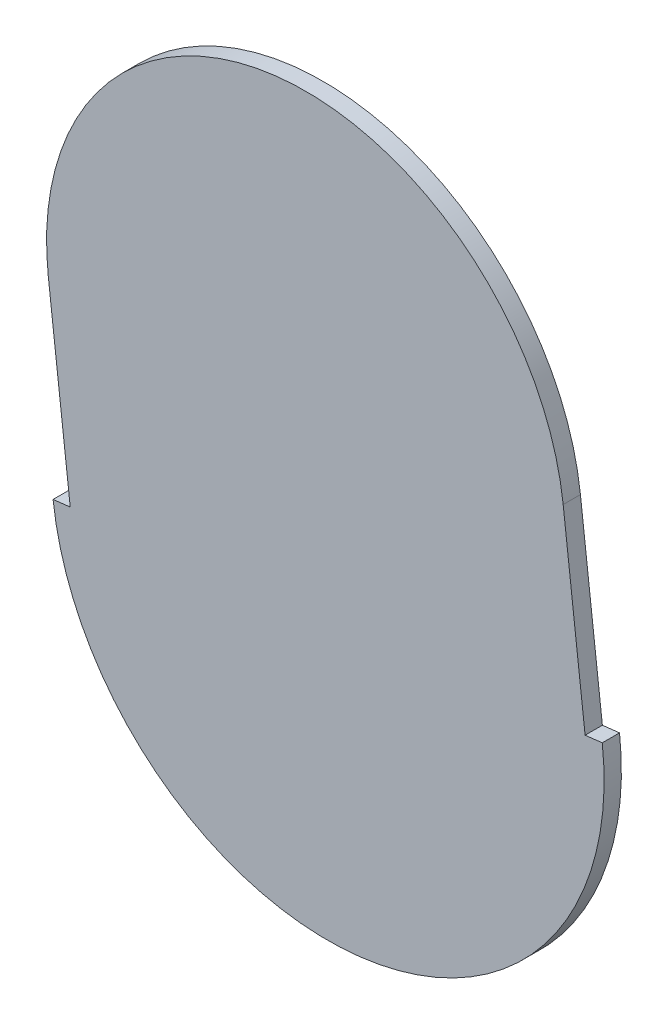
ISO-10303-21;
HEADER;
FILE_DESCRIPTION(('STEP AP214'),'2;1');
FILE_NAME('part.step','',(''),(''),'','','');
FILE_SCHEMA(('AUTOMOTIVE_DESIGN { 1 0 10303 214 1 1 1 1 }'));
ENDSEC;
DATA;
#1=APPLICATION_CONTEXT('core data for automotive mechanical design processes');
#2=APPLICATION_PROTOCOL_DEFINITION('international standard','automotive_design',2000,#1);
#3=PRODUCT_CONTEXT('',#1,'mechanical');
#4=PRODUCT('Part','Part','',(#3));
#5=PRODUCT_RELATED_PRODUCT_CATEGORY('part','',(#4));
#6=PRODUCT_DEFINITION_FORMATION('','',#4);
#7=PRODUCT_DEFINITION_CONTEXT('part definition',#1,'design');
#8=PRODUCT_DEFINITION('design','',#6,#7);
#9=PRODUCT_DEFINITION_SHAPE('','',#8);
#10=(LENGTH_UNIT() NAMED_UNIT(*) SI_UNIT(.MILLI.,.METRE.));
#11=(NAMED_UNIT(*) PLANE_ANGLE_UNIT() SI_UNIT($,.RADIAN.));
#12=(NAMED_UNIT(*) SI_UNIT($,.STERADIAN.) SOLID_ANGLE_UNIT());
#13=UNCERTAINTY_MEASURE_WITH_UNIT(LENGTH_MEASURE(1.E-05),#10,'distance_accuracy_value','');
#14=(GEOMETRIC_REPRESENTATION_CONTEXT(3) GLOBAL_UNCERTAINTY_ASSIGNED_CONTEXT((#13)) GLOBAL_UNIT_ASSIGNED_CONTEXT((#10,
#11,#12)) REPRESENTATION_CONTEXT('',''));
#15=CARTESIAN_POINT('',(0.,0.,0.));
#16=DIRECTION('',(0.,0.,1.));
#17=DIRECTION('',(1.,0.,0.));
#18=AXIS2_PLACEMENT_3D('',#15,#16,#17);
#19=CARTESIAN_POINT('',(548.963766509563,36.6164479003413,218.190394221551));
#20=DIRECTION('',(0.,0.,1.));
#21=DIRECTION('',(-0.993314481568456,-0.11543977090409,0.));
#22=AXIS2_PLACEMENT_3D('',#19,#20,#21);
#23=CYLINDRICAL_SURFACE('',#22,10.);
#24=CARTESIAN_POINT('',(548.963766509563,36.6164479003413,218.190394221551));
#25=DIRECTION('',(0.,0.,-1.));
#26=DIRECTION('',(0.993314481568456,0.11543977090409,0.));
#27=AXIS2_PLACEMENT_3D('',#24,#25,#26);
#28=CIRCLE('',#27,10.);
#29=CARTESIAN_POINT('',(558.896911325247,37.7708456093822,218.190394221551));
#30=VERTEX_POINT('',#29);
#31=EDGE_CURVE('E11',#30,#30,#28,.T.);
#32=ORIENTED_EDGE('',*,*,#31,.F.);
#33=EDGE_LOOP('',(#32));
#34=FACE_BOUND('',#33,.T.);
#35=CARTESIAN_POINT('',(548.963766509563,36.6164479003413,219.190394221551));
#36=DIRECTION('',(0.,0.,1.));
#37=DIRECTION('',(-0.993314481568456,-0.11543977090409,0.));
#38=AXIS2_PLACEMENT_3D('',#35,#36,#37);
#39=CIRCLE('',#38,10.);
#40=CARTESIAN_POINT('',(539.030621693878,35.4620501913004,219.190394221551));
#41=VERTEX_POINT('',#40);
#42=EDGE_CURVE('E48',#41,#41,#39,.T.);
#43=ORIENTED_EDGE('',*,*,#42,.F.);
#44=EDGE_LOOP('',(#43));
#45=FACE_BOUND('',#44,.T.);
#46=ADVANCED_FACE('F40',(#34,#45),#23,.T.);
#47=CARTESIAN_POINT('',(548.963766509563,36.6164479003413,218.190394221551));
#48=DIRECTION('',(0.,0.,-1.));
#49=DIRECTION('',(0.993314481568456,0.11543977090409,0.));
#50=AXIS2_PLACEMENT_3D('',#47,#48,#49);
#51=PLANE('',#50);
#52=ORIENTED_EDGE('',*,*,#31,.T.);
#53=EDGE_LOOP('',(#52));
#54=FACE_BOUND('',#53,.T.);
#55=ADVANCED_FACE('F149',(#54),#51,.T.);
#56=CARTESIAN_POINT('',(550.233603989508,25.6899886030883,219.190394221551));
#57=DIRECTION('',(0.,0.,1.));
#58=DIRECTION('',(-0.993314481568456,-0.11543977090409,0.));
#59=AXIS2_PLACEMENT_3D('',#56,#57,#58);
#60=PLANE('',#59);
#61=CARTESIAN_POINT('',(550.233603989508,25.6899886030883,219.190394221551));
#62=DIRECTION('',(0.,0.,1.));
#63=DIRECTION('',(-0.993314481568456,-0.11543977090409,0.));
#64=AXIS2_PLACEMENT_3D('',#61,#62,#63);
#65=CIRCLE('',#64,16.);
#66=CARTESIAN_POINT('',(534.340572284412,23.8429522686229,219.190394221551));
#67=VERTEX_POINT('',#66);
#68=CARTESIAN_POINT('',(566.126635694603,27.5370249375537,219.190394221551));
#69=VERTEX_POINT('',#68);
#70=EDGE_CURVE('E125',#67,#69,#65,.T.);
#71=ORIENTED_EDGE('',*,*,#70,.F.);
#72=DIRECTION('',(-0.993314481568457,-0.115439770904087,0.));
#73=VECTOR('',#72,1.);
#74=CARTESIAN_POINT('',(535.333886765981,23.9583920395269,219.190394221551));
#75=LINE('',#74,#73);
#76=CARTESIAN_POINT('',(535.333886765981,23.9583920395269,219.190394221551));
#77=VERTEX_POINT('',#76);
#78=EDGE_CURVE('E85',#77,#67,#75,.T.);
#79=ORIENTED_EDGE('',*,*,#78,.F.);
#80=DIRECTION('',(0.11543977090409,-0.993314481568456,0.));
#81=VECTOR('',#80,1.);
#82=CARTESIAN_POINT('',(534.064049286036,34.88485133678,219.190394221551));
#83=LINE('',#82,#81);
#84=CARTESIAN_POINT('',(534.064049286036,34.88485133678,219.190394221551));
#85=VERTEX_POINT('',#84);
#86=EDGE_CURVE('E79',#85,#77,#83,.T.);
#87=ORIENTED_EDGE('',*,*,#86,.F.);
#88=CARTESIAN_POINT('',(548.963766509563,36.6164479003413,219.190394221551));
#89=DIRECTION('',(0.,0.,1.));
#90=DIRECTION('',(-0.993314481568456,-0.11543977090409,0.));
#91=AXIS2_PLACEMENT_3D('',#88,#89,#90);
#92=CIRCLE('',#91,15.);
#93=CARTESIAN_POINT('',(563.86348373309,38.3480444639027,219.190394221551));
#94=VERTEX_POINT('',#93);
#95=EDGE_CURVE('E115',#94,#85,#92,.T.);
#96=ORIENTED_EDGE('',*,*,#95,.F.);
#97=DIRECTION('',(-0.11543977090409,0.993314481568456,0.));
#98=VECTOR('',#97,1.);
#99=CARTESIAN_POINT('',(563.86348373309,38.3480444639027,219.190394221551));
#100=LINE('',#99,#98);
#101=CARTESIAN_POINT('',(565.133321213034,27.4215851666496,219.190394221551));
#102=VERTEX_POINT('',#101);
#103=EDGE_CURVE('E130',#102,#94,#100,.T.);
#104=ORIENTED_EDGE('',*,*,#103,.F.);
#105=DIRECTION('',(-0.993314481568457,-0.115439770904085,0.));
#106=VECTOR('',#105,1.);
#107=CARTESIAN_POINT('',(565.133321213034,27.4215851666496,219.190394221551));
#108=LINE('',#107,#106);
#109=EDGE_CURVE('E128',#69,#102,#108,.T.);
#110=ORIENTED_EDGE('',*,*,#109,.F.);
#111=EDGE_LOOP('',(#71,#79,#87,#96,#104,#110));
#112=FACE_BOUND('',#111,.T.);
#113=ORIENTED_EDGE('',*,*,#42,.T.);
#114=EDGE_LOOP('',(#113));
#115=FACE_BOUND('',#114,.T.);
#116=ADVANCED_FACE('F146',(#112,#115),#60,.F.);
#117=CARTESIAN_POINT('',(550.233603989508,25.6899886030883,220.190394221551));
#118=DIRECTION('',(0.,0.,-1.));
#119=DIRECTION('',(0.993314481568456,0.11543977090409,0.));
#120=AXIS2_PLACEMENT_3D('',#117,#118,#119);
#121=CYLINDRICAL_SURFACE('',#120,16.);
#122=ORIENTED_EDGE('',*,*,#70,.T.);
#123=DIRECTION('',(0.,0.,-1.));
#124=VECTOR('',#123,1.);
#125=CARTESIAN_POINT('',(566.126635694603,27.5370249375537,220.190394221551));
#126=LINE('',#125,#124);
#127=CARTESIAN_POINT('',(566.126635694603,27.5370249375537,220.190394221551));
#128=VERTEX_POINT('',#127);
#129=EDGE_CURVE('E142',#128,#69,#126,.T.);
#130=ORIENTED_EDGE('',*,*,#129,.F.);
#131=CARTESIAN_POINT('',(550.233603989508,25.6899886030883,220.190394221551));
#132=DIRECTION('',(0.,0.,1.));
#133=DIRECTION('',(-0.993314481568456,-0.11543977090409,0.));
#134=AXIS2_PLACEMENT_3D('',#131,#132,#133);
#135=CIRCLE('',#134,16.);
#136=CARTESIAN_POINT('',(534.340572284412,23.8429522686229,220.190394221551));
#137=VERTEX_POINT('',#136);
#138=EDGE_CURVE('E135',#137,#128,#135,.T.);
#139=ORIENTED_EDGE('',*,*,#138,.F.);
#140=DIRECTION('',(0.,0.,-1.));
#141=VECTOR('',#140,1.);
#142=CARTESIAN_POINT('',(534.340572284412,23.8429522686229,220.190394221551));
#143=LINE('',#142,#141);
#144=EDGE_CURVE('E121',#137,#67,#143,.T.);
#145=ORIENTED_EDGE('',*,*,#144,.T.);
#146=EDGE_LOOP('',(#122,#130,#139,#145));
#147=FACE_BOUND('',#146,.T.);
#148=ADVANCED_FACE('F159',(#147),#121,.T.);
#149=CARTESIAN_POINT('',(565.133321213034,27.4215851666496,220.190394221551));
#150=DIRECTION('',(0.115439770904085,-0.993314481568457,0.));
#151=DIRECTION('',(-0.993314481568457,-0.115439770904085,0.));
#152=AXIS2_PLACEMENT_3D('',#149,#150,#151);
#153=PLANE('',#152);
#154=ORIENTED_EDGE('',*,*,#109,.T.);
#155=DIRECTION('',(0.,0.,-1.));
#156=VECTOR('',#155,1.);
#157=CARTESIAN_POINT('',(565.133321213034,27.4215851666496,220.190394221551));
#158=LINE('',#157,#156);
#159=CARTESIAN_POINT('',(565.133321213034,27.4215851666496,220.190394221551));
#160=VERTEX_POINT('',#159);
#161=EDGE_CURVE('E139',#160,#102,#158,.T.);
#162=ORIENTED_EDGE('',*,*,#161,.F.);
#163=DIRECTION('',(-0.993314481568457,-0.115439770904085,0.));
#164=VECTOR('',#163,1.);
#165=CARTESIAN_POINT('',(565.133321213034,27.4215851666496,220.190394221551));
#166=LINE('',#165,#164);
#167=EDGE_CURVE('E94',#128,#160,#166,.T.);
#168=ORIENTED_EDGE('',*,*,#167,.F.);
#169=ORIENTED_EDGE('',*,*,#129,.T.);
#170=EDGE_LOOP('',(#154,#162,#168,#169));
#171=FACE_BOUND('',#170,.T.);
#172=ADVANCED_FACE('F165',(#171),#153,.F.);
#173=CARTESIAN_POINT('',(563.86348373309,38.3480444639027,220.190394221551));
#174=DIRECTION('',(-0.993314481568456,-0.11543977090409,0.));
#175=DIRECTION('',(-0.11543977090409,0.993314481568456,0.));
#176=AXIS2_PLACEMENT_3D('',#173,#174,#175);
#177=PLANE('',#176);
#178=ORIENTED_EDGE('',*,*,#103,.T.);
#179=DIRECTION('',(0.,0.,-1.));
#180=VECTOR('',#179,1.);
#181=CARTESIAN_POINT('',(563.86348373309,38.3480444639027,220.190394221551));
#182=LINE('',#181,#180);
#183=CARTESIAN_POINT('',(563.86348373309,38.3480444639027,220.190394221551));
#184=VERTEX_POINT('',#183);
#185=EDGE_CURVE('E116',#184,#94,#182,.T.);
#186=ORIENTED_EDGE('',*,*,#185,.F.);
#187=DIRECTION('',(-0.11543977090409,0.993314481568456,0.));
#188=VECTOR('',#187,1.);
#189=CARTESIAN_POINT('',(563.86348373309,38.3480444639027,220.190394221551));
#190=LINE('',#189,#188);
#191=EDGE_CURVE('E107',#160,#184,#190,.T.);
#192=ORIENTED_EDGE('',*,*,#191,.F.);
#193=ORIENTED_EDGE('',*,*,#161,.T.);
#194=EDGE_LOOP('',(#178,#186,#192,#193));
#195=FACE_BOUND('',#194,.T.);
#196=ADVANCED_FACE('F169',(#195),#177,.F.);
#197=CARTESIAN_POINT('',(548.963766509563,36.6164479003413,220.190394221551));
#198=DIRECTION('',(0.,0.,-1.));
#199=DIRECTION('',(0.993314481568456,0.11543977090409,0.));
#200=AXIS2_PLACEMENT_3D('',#197,#198,#199);
#201=CYLINDRICAL_SURFACE('',#200,15.);
#202=ORIENTED_EDGE('',*,*,#95,.T.);
#203=DIRECTION('',(0.,0.,-1.));
#204=VECTOR('',#203,1.);
#205=CARTESIAN_POINT('',(534.064049286036,34.88485133678,220.190394221551));
#206=LINE('',#205,#204);
#207=CARTESIAN_POINT('',(534.064049286036,34.88485133678,220.190394221551));
#208=VERTEX_POINT('',#207);
#209=EDGE_CURVE('E112',#208,#85,#206,.T.);
#210=ORIENTED_EDGE('',*,*,#209,.F.);
#211=CARTESIAN_POINT('',(548.963766509563,36.6164479003413,220.190394221551));
#212=DIRECTION('',(0.,0.,1.));
#213=DIRECTION('',(-0.993314481568456,-0.11543977090409,0.));
#214=AXIS2_PLACEMENT_3D('',#211,#212,#213);
#215=CIRCLE('',#214,15.);
#216=EDGE_CURVE('E101',#184,#208,#215,.T.);
#217=ORIENTED_EDGE('',*,*,#216,.F.);
#218=ORIENTED_EDGE('',*,*,#185,.T.);
#219=EDGE_LOOP('',(#202,#210,#217,#218));
#220=FACE_BOUND('',#219,.T.);
#221=ADVANCED_FACE('F113',(#220),#201,.T.);
#222=CARTESIAN_POINT('',(534.064049286036,34.88485133678,220.190394221551));
#223=DIRECTION('',(0.993314481568456,0.11543977090409,0.));
#224=DIRECTION('',(0.11543977090409,-0.993314481568456,0.));
#225=AXIS2_PLACEMENT_3D('',#222,#223,#224);
#226=PLANE('',#225);
#227=ORIENTED_EDGE('',*,*,#86,.T.);
#228=DIRECTION('',(0.,0.,-1.));
#229=VECTOR('',#228,1.);
#230=CARTESIAN_POINT('',(535.333886765981,23.9583920395269,220.190394221551));
#231=LINE('',#230,#229);
#232=CARTESIAN_POINT('',(535.333886765981,23.9583920395269,220.190394221551));
#233=VERTEX_POINT('',#232);
#234=EDGE_CURVE('E117',#233,#77,#231,.T.);
#235=ORIENTED_EDGE('',*,*,#234,.F.);
#236=DIRECTION('',(0.11543977090409,-0.993314481568456,0.));
#237=VECTOR('',#236,1.);
#238=CARTESIAN_POINT('',(534.064049286036,34.88485133678,220.190394221551));
#239=LINE('',#238,#237);
#240=EDGE_CURVE('E105',#208,#233,#239,.T.);
#241=ORIENTED_EDGE('',*,*,#240,.F.);
#242=ORIENTED_EDGE('',*,*,#209,.T.);
#243=EDGE_LOOP('',(#227,#235,#241,#242));
#244=FACE_BOUND('',#243,.T.);
#245=ADVANCED_FACE('F119',(#244),#226,.F.);
#246=CARTESIAN_POINT('',(535.333886765981,23.9583920395269,220.190394221551));
#247=DIRECTION('',(0.115439770904087,-0.993314481568457,0.));
#248=DIRECTION('',(-0.993314481568457,-0.115439770904087,0.));
#249=AXIS2_PLACEMENT_3D('',#246,#247,#248);
#250=PLANE('',#249);
#251=ORIENTED_EDGE('',*,*,#78,.T.);
#252=ORIENTED_EDGE('',*,*,#144,.F.);
#253=DIRECTION('',(-0.993314481568457,-0.115439770904087,0.));
#254=VECTOR('',#253,1.);
#255=CARTESIAN_POINT('',(535.333886765981,23.9583920395269,220.190394221551));
#256=LINE('',#255,#254);
#257=EDGE_CURVE('E56',#233,#137,#256,.T.);
#258=ORIENTED_EDGE('',*,*,#257,.F.);
#259=ORIENTED_EDGE('',*,*,#234,.T.);
#260=EDGE_LOOP('',(#251,#252,#258,#259));
#261=FACE_BOUND('',#260,.T.);
#262=ADVANCED_FACE('F177',(#261),#250,.F.);
#263=CARTESIAN_POINT('',(550.233603989508,25.6899886030883,220.190394221551));
#264=DIRECTION('',(0.,0.,1.));
#265=DIRECTION('',(-0.993314481568456,-0.11543977090409,0.));
#266=AXIS2_PLACEMENT_3D('',#263,#264,#265);
#267=PLANE('',#266);
#268=ORIENTED_EDGE('',*,*,#138,.T.);
#269=ORIENTED_EDGE('',*,*,#167,.T.);
#270=ORIENTED_EDGE('',*,*,#191,.T.);
#271=ORIENTED_EDGE('',*,*,#216,.T.);
#272=ORIENTED_EDGE('',*,*,#240,.T.);
#273=ORIENTED_EDGE('',*,*,#257,.T.);
#274=EDGE_LOOP('',(#268,#269,#270,#271,#272,#273));
#275=FACE_BOUND('',#274,.T.);
#276=ADVANCED_FACE('F103',(#275),#267,.T.);
#277=CLOSED_SHELL('',(#46,#55,#116,#148,#172,#196,#221,#245,#262,#276));
#278=MANIFOLD_SOLID_BREP('B2',#277);
#279=ADVANCED_BREP_SHAPE_REPRESENTATION('',(#18,#278),#14);
#280=SHAPE_DEFINITION_REPRESENTATION(#9,#279);
ENDSEC;
END-ISO-10303-21;
